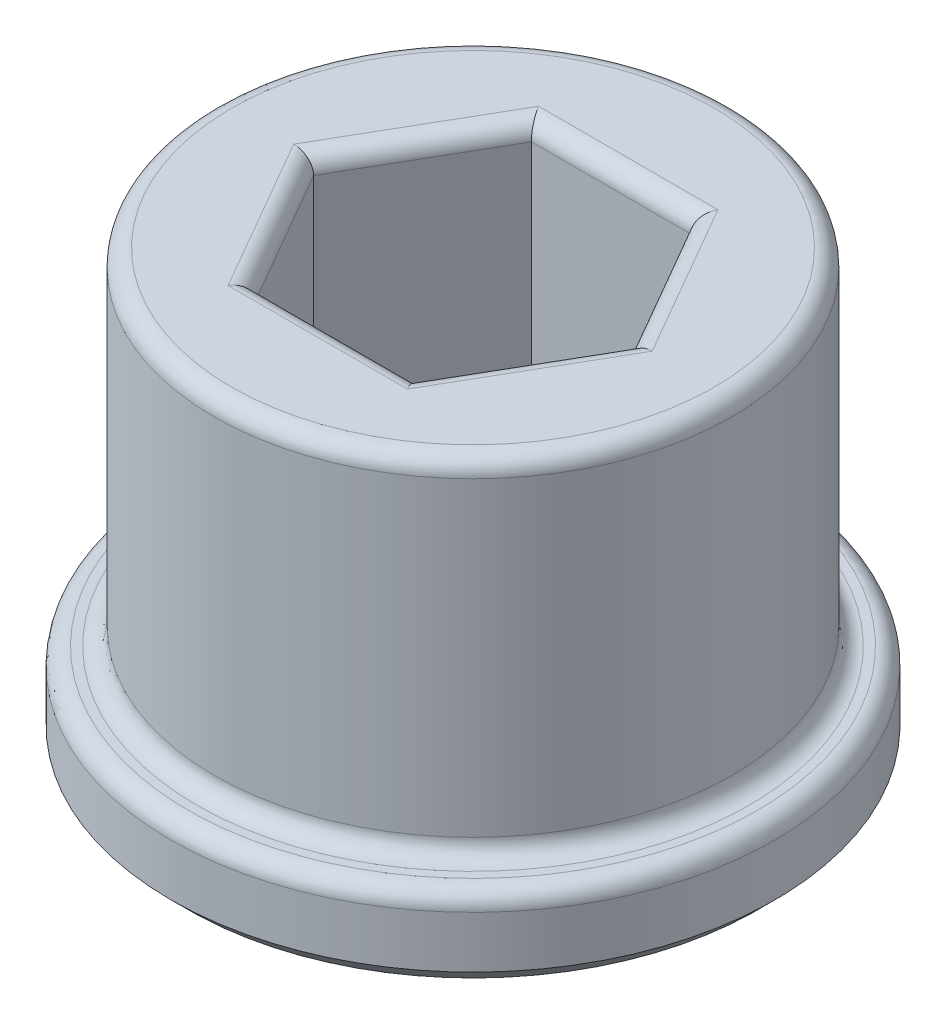
ISO-10303-21;
HEADER;
FILE_DESCRIPTION(('STEP AP214'),'2;1');
FILE_NAME('part.step','',(''),(''),'','','');
FILE_SCHEMA(('AUTOMOTIVE_DESIGN { 1 0 10303 214 1 1 1 1 }'));
ENDSEC;
DATA;
#1=APPLICATION_CONTEXT('core data for automotive mechanical design processes');
#2=APPLICATION_PROTOCOL_DEFINITION('international standard','automotive_design',2000,#1);
#3=PRODUCT_CONTEXT('',#1,'mechanical');
#4=PRODUCT('Part','Part','',(#3));
#5=PRODUCT_RELATED_PRODUCT_CATEGORY('part','',(#4));
#6=PRODUCT_DEFINITION_FORMATION('','',#4);
#7=PRODUCT_DEFINITION_CONTEXT('part definition',#1,'design');
#8=PRODUCT_DEFINITION('design','',#6,#7);
#9=PRODUCT_DEFINITION_SHAPE('','',#8);
#10=(LENGTH_UNIT() NAMED_UNIT(*) SI_UNIT(.MILLI.,.METRE.));
#11=(NAMED_UNIT(*) PLANE_ANGLE_UNIT() SI_UNIT($,.RADIAN.));
#12=(NAMED_UNIT(*) SI_UNIT($,.STERADIAN.) SOLID_ANGLE_UNIT());
#13=UNCERTAINTY_MEASURE_WITH_UNIT(LENGTH_MEASURE(1.E-05),#10,'distance_accuracy_value','');
#14=(GEOMETRIC_REPRESENTATION_CONTEXT(3) GLOBAL_UNCERTAINTY_ASSIGNED_CONTEXT((#13)) GLOBAL_UNIT_ASSIGNED_CONTEXT((#10,
#11,#12)) REPRESENTATION_CONTEXT('',''));
#15=CARTESIAN_POINT('',(0.,0.,0.));
#16=DIRECTION('',(0.,0.,1.));
#17=DIRECTION('',(1.,0.,0.));
#18=AXIS2_PLACEMENT_3D('',#15,#16,#17);
#19=CARTESIAN_POINT('',(0.,7.9375,0.));
#20=DIRECTION('',(0.,-1.,0.));
#21=DIRECTION('',(0.,0.,-1.));
#22=AXIS2_PLACEMENT_3D('',#19,#20,#21);
#23=CYLINDRICAL_SURFACE('',#22,9.525);
#24=CARTESIAN_POINT('',(0.,12.065,0.));
#25=DIRECTION('',(0.,1.,0.));
#26=DIRECTION('',(0.,0.,1.));
#27=AXIS2_PLACEMENT_3D('',#24,#25,#26);
#28=CIRCLE('',#27,9.525);
#29=CARTESIAN_POINT('',(0.,12.065,9.525));
#30=VERTEX_POINT('',#29);
#31=EDGE_CURVE('E250',#30,#30,#28,.F.);
#32=ORIENTED_EDGE('',*,*,#31,.T.);
#33=EDGE_LOOP('',(#32));
#34=FACE_BOUND('',#33,.T.);
#35=CARTESIAN_POINT('',(0.,0.635,0.));
#36=DIRECTION('',(0.,-1.,0.));
#37=DIRECTION('',(0.,0.,-1.));
#38=AXIS2_PLACEMENT_3D('',#35,#36,#37);
#39=CIRCLE('',#38,9.525);
#40=CARTESIAN_POINT('',(0.,0.635,-9.525));
#41=VERTEX_POINT('',#40);
#42=EDGE_CURVE('E205',#41,#41,#39,.F.);
#43=ORIENTED_EDGE('',*,*,#42,.T.);
#44=EDGE_LOOP('',(#43));
#45=FACE_BOUND('',#44,.T.);
#46=ADVANCED_FACE('F51',(#34,#45),#23,.T.);
#47=CARTESIAN_POINT('',(2.9329393674833,7.9375,5.08));
#48=DIRECTION('',(-0.866025403784439,0.,-0.5));
#49=DIRECTION('',(-0.5,0.,0.866025403784439));
#50=AXIS2_PLACEMENT_3D('',#47,#48,#49);
#51=PLANE('',#50);
#52=DIRECTION('',(0.,-1.,0.));
#53=VECTOR('',#52,1.);
#54=CARTESIAN_POINT('',(5.8658787349666,7.9375,0.));
#55=LINE('',#54,#53);
#56=CARTESIAN_POINT('',(5.8658787349666,12.065,0.));
#57=VERTEX_POINT('',#56);
#58=CARTESIAN_POINT('',(5.8658787349666,-2.54,0.));
#59=VERTEX_POINT('',#58);
#60=EDGE_CURVE('E201',#57,#59,#55,.T.);
#61=ORIENTED_EDGE('',*,*,#60,.T.);
#62=DIRECTION('',(-0.5,0.,0.866025403784439));
#63=VECTOR('',#62,1.);
#64=CARTESIAN_POINT('',(2.9329393674833,-2.54,5.08));
#65=LINE('',#64,#63);
#66=CARTESIAN_POINT('',(2.9329393674833,-2.54,5.08));
#67=VERTEX_POINT('',#66);
#68=EDGE_CURVE('E296',#59,#67,#65,.T.);
#69=ORIENTED_EDGE('',*,*,#68,.T.);
#70=DIRECTION('',(0.,-1.,0.));
#71=VECTOR('',#70,1.);
#72=CARTESIAN_POINT('',(2.9329393674833,7.9375,5.08));
#73=LINE('',#72,#71);
#74=CARTESIAN_POINT('',(2.9329393674833,12.065,5.08));
#75=VERTEX_POINT('',#74);
#76=EDGE_CURVE('E184',#75,#67,#73,.T.);
#77=ORIENTED_EDGE('',*,*,#76,.F.);
#78=DIRECTION('',(0.5,0.,-0.866025403784439));
#79=VECTOR('',#78,1.);
#80=CARTESIAN_POINT('',(2.9329393674833,12.065,5.08));
#81=LINE('',#80,#79);
#82=EDGE_CURVE('E170',#75,#57,#81,.T.);
#83=ORIENTED_EDGE('',*,*,#82,.T.);
#84=EDGE_LOOP('',(#61,#69,#77,#83));
#85=FACE_BOUND('',#84,.T.);
#86=ADVANCED_FACE('F386',(#85),#51,.T.);
#87=CARTESIAN_POINT('',(5.8658787349666,7.9375,0.));
#88=DIRECTION('',(-0.866025403784438,0.,0.5));
#89=DIRECTION('',(0.5,0.,0.866025403784438));
#90=AXIS2_PLACEMENT_3D('',#87,#88,#89);
#91=PLANE('',#90);
#92=DIRECTION('',(0.,-1.,0.));
#93=VECTOR('',#92,1.);
#94=CARTESIAN_POINT('',(2.9329393674833,7.9375,-5.08));
#95=LINE('',#94,#93);
#96=CARTESIAN_POINT('',(2.9329393674833,12.065,-5.08));
#97=VERTEX_POINT('',#96);
#98=CARTESIAN_POINT('',(2.9329393674833,-2.54,-5.08));
#99=VERTEX_POINT('',#98);
#100=EDGE_CURVE('E197',#97,#99,#95,.T.);
#101=ORIENTED_EDGE('',*,*,#100,.T.);
#102=DIRECTION('',(0.5,0.,0.866025403784438));
#103=VECTOR('',#102,1.);
#104=CARTESIAN_POINT('',(5.8658787349666,-2.54,0.));
#105=LINE('',#104,#103);
#106=EDGE_CURVE('E253',#99,#59,#105,.T.);
#107=ORIENTED_EDGE('',*,*,#106,.T.);
#108=ORIENTED_EDGE('',*,*,#60,.F.);
#109=DIRECTION('',(-0.5,0.,-0.866025403784438));
#110=VECTOR('',#109,1.);
#111=CARTESIAN_POINT('',(5.8658787349666,12.065,0.));
#112=LINE('',#111,#110);
#113=EDGE_CURVE('E241',#57,#97,#112,.T.);
#114=ORIENTED_EDGE('',*,*,#113,.T.);
#115=EDGE_LOOP('',(#101,#107,#108,#114));
#116=FACE_BOUND('',#115,.T.);
#117=ADVANCED_FACE('F354',(#116),#91,.T.);
#118=CARTESIAN_POINT('',(2.9329393674833,7.9375,-5.08));
#119=DIRECTION('',(0.,0.,1.));
#120=DIRECTION('',(1.,0.,0.));
#121=AXIS2_PLACEMENT_3D('',#118,#119,#120);
#122=PLANE('',#121);
#123=DIRECTION('',(0.,-1.,0.));
#124=VECTOR('',#123,1.);
#125=CARTESIAN_POINT('',(-2.9329393674833,7.9375,-5.08));
#126=LINE('',#125,#124);
#127=CARTESIAN_POINT('',(-2.9329393674833,12.065,-5.08));
#128=VERTEX_POINT('',#127);
#129=CARTESIAN_POINT('',(-2.9329393674833,-2.54,-5.08));
#130=VERTEX_POINT('',#129);
#131=EDGE_CURVE('E189',#128,#130,#126,.T.);
#132=ORIENTED_EDGE('',*,*,#131,.T.);
#133=DIRECTION('',(1.,0.,0.));
#134=VECTOR('',#133,1.);
#135=CARTESIAN_POINT('',(2.9329393674833,-2.54,-5.08));
#136=LINE('',#135,#134);
#137=EDGE_CURVE('E62',#130,#99,#136,.T.);
#138=ORIENTED_EDGE('',*,*,#137,.T.);
#139=ORIENTED_EDGE('',*,*,#100,.F.);
#140=DIRECTION('',(-1.,0.,0.));
#141=VECTOR('',#140,1.);
#142=CARTESIAN_POINT('',(2.9329393674833,12.065,-5.08));
#143=LINE('',#142,#141);
#144=EDGE_CURVE('E244',#97,#128,#143,.T.);
#145=ORIENTED_EDGE('',*,*,#144,.T.);
#146=EDGE_LOOP('',(#132,#138,#139,#145));
#147=FACE_BOUND('',#146,.T.);
#148=ADVANCED_FACE('F351',(#147),#122,.T.);
#149=CARTESIAN_POINT('',(-2.9329393674833,7.9375,-5.08));
#150=DIRECTION('',(0.866025403784438,0.,0.5));
#151=DIRECTION('',(0.5,0.,-0.866025403784439));
#152=AXIS2_PLACEMENT_3D('',#149,#150,#151);
#153=PLANE('',#152);
#154=DIRECTION('',(0.,-1.,0.));
#155=VECTOR('',#154,1.);
#156=CARTESIAN_POINT('',(-5.8658787349666,7.9375,0.));
#157=LINE('',#156,#155);
#158=CARTESIAN_POINT('',(-5.8658787349666,12.065,0.));
#159=VERTEX_POINT('',#158);
#160=CARTESIAN_POINT('',(-5.8658787349666,-2.54,0.));
#161=VERTEX_POINT('',#160);
#162=EDGE_CURVE('E174',#159,#161,#157,.T.);
#163=ORIENTED_EDGE('',*,*,#162,.T.);
#164=DIRECTION('',(0.5,0.,-0.866025403784439));
#165=VECTOR('',#164,1.);
#166=CARTESIAN_POINT('',(-2.9329393674833,-2.54,-5.08));
#167=LINE('',#166,#165);
#168=EDGE_CURVE('E70',#161,#130,#167,.T.);
#169=ORIENTED_EDGE('',*,*,#168,.T.);
#170=ORIENTED_EDGE('',*,*,#131,.F.);
#171=DIRECTION('',(-0.5,0.,0.866025403784439));
#172=VECTOR('',#171,1.);
#173=CARTESIAN_POINT('',(-2.9329393674833,12.065,-5.08));
#174=LINE('',#173,#172);
#175=EDGE_CURVE('E247',#128,#159,#174,.T.);
#176=ORIENTED_EDGE('',*,*,#175,.T.);
#177=EDGE_LOOP('',(#163,#169,#170,#176));
#178=FACE_BOUND('',#177,.T.);
#179=ADVANCED_FACE('F374',(#178),#153,.T.);
#180=CARTESIAN_POINT('',(-5.8658787349666,7.9375,0.));
#181=DIRECTION('',(0.866025403784438,0.,-0.5));
#182=DIRECTION('',(-0.5,0.,-0.866025403784439));
#183=AXIS2_PLACEMENT_3D('',#180,#181,#182);
#184=PLANE('',#183);
#185=DIRECTION('',(0.,-1.,0.));
#186=VECTOR('',#185,1.);
#187=CARTESIAN_POINT('',(-2.9329393674833,7.9375,5.08));
#188=LINE('',#187,#186);
#189=CARTESIAN_POINT('',(-2.9329393674833,12.065,5.08));
#190=VERTEX_POINT('',#189);
#191=CARTESIAN_POINT('',(-2.9329393674833,-2.54,5.08));
#192=VERTEX_POINT('',#191);
#193=EDGE_CURVE('E173',#190,#192,#188,.T.);
#194=ORIENTED_EDGE('',*,*,#193,.T.);
#195=DIRECTION('',(-0.5,0.,-0.866025403784439));
#196=VECTOR('',#195,1.);
#197=CARTESIAN_POINT('',(-5.8658787349666,-2.54,0.));
#198=LINE('',#197,#196);
#199=EDGE_CURVE('E78',#192,#161,#198,.T.);
#200=ORIENTED_EDGE('',*,*,#199,.T.);
#201=ORIENTED_EDGE('',*,*,#162,.F.);
#202=DIRECTION('',(0.5,0.,0.866025403784439));
#203=VECTOR('',#202,1.);
#204=CARTESIAN_POINT('',(-5.8658787349666,12.065,0.));
#205=LINE('',#204,#203);
#206=EDGE_CURVE('E152',#159,#190,#205,.T.);
#207=ORIENTED_EDGE('',*,*,#206,.T.);
#208=EDGE_LOOP('',(#194,#200,#201,#207));
#209=FACE_BOUND('',#208,.T.);
#210=ADVANCED_FACE('F172',(#209),#184,.T.);
#211=CARTESIAN_POINT('',(-2.9329393674833,7.9375,5.08));
#212=DIRECTION('',(0.,0.,-1.));
#213=DIRECTION('',(-1.,0.,0.));
#214=AXIS2_PLACEMENT_3D('',#211,#212,#213);
#215=PLANE('',#214);
#216=ORIENTED_EDGE('',*,*,#76,.T.);
#217=DIRECTION('',(-1.,0.,0.));
#218=VECTOR('',#217,1.);
#219=CARTESIAN_POINT('',(-2.9329393674833,-2.54,5.08));
#220=LINE('',#219,#218);
#221=EDGE_CURVE('E182',#67,#192,#220,.T.);
#222=ORIENTED_EDGE('',*,*,#221,.T.);
#223=ORIENTED_EDGE('',*,*,#193,.F.);
#224=DIRECTION('',(1.,0.,0.));
#225=VECTOR('',#224,1.);
#226=CARTESIAN_POINT('',(-2.9329393674833,12.065,5.08));
#227=LINE('',#226,#225);
#228=EDGE_CURVE('E161',#190,#75,#227,.T.);
#229=ORIENTED_EDGE('',*,*,#228,.T.);
#230=EDGE_LOOP('',(#216,#222,#223,#229));
#231=FACE_BOUND('',#230,.T.);
#232=ADVANCED_FACE('F180',(#231),#215,.T.);
#233=CARTESIAN_POINT('',(0.,12.7,0.));
#234=DIRECTION('',(0.,1.,0.));
#235=DIRECTION('',(0.,0.,1.));
#236=AXIS2_PLACEMENT_3D('',#233,#234,#235);
#237=PLANE('',#236);
#238=DIRECTION('',(1.,0.,0.));
#239=VECTOR('',#238,1.);
#240=CARTESIAN_POINT('',(0.,12.7,5.715));
#241=LINE('',#240,#239);
#242=CARTESIAN_POINT('',(3.29955678841871,12.7,5.715));
#243=VERTEX_POINT('',#242);
#244=CARTESIAN_POINT('',(-3.29955678841871,12.7,5.715));
#245=VERTEX_POINT('',#244);
#246=EDGE_CURVE('E234',#243,#245,#241,.F.);
#247=ORIENTED_EDGE('',*,*,#246,.T.);
#248=DIRECTION('',(0.5,0.,0.866025403784439));
#249=VECTOR('',#248,1.);
#250=CARTESIAN_POINT('',(-4.94933518262807,12.7,2.8575));
#251=LINE('',#250,#249);
#252=CARTESIAN_POINT('',(-6.59911357683742,12.7,0.));
#253=VERTEX_POINT('',#252);
#254=EDGE_CURVE('E154',#245,#253,#251,.F.);
#255=ORIENTED_EDGE('',*,*,#254,.T.);
#256=DIRECTION('',(-0.5,0.,0.866025403784439));
#257=VECTOR('',#256,1.);
#258=CARTESIAN_POINT('',(-4.94933518262807,12.7,-2.8575));
#259=LINE('',#258,#257);
#260=CARTESIAN_POINT('',(-3.29955678841871,12.7,-5.715));
#261=VERTEX_POINT('',#260);
#262=EDGE_CURVE('E223',#253,#261,#259,.F.);
#263=ORIENTED_EDGE('',*,*,#262,.T.);
#264=DIRECTION('',(-1.,0.,0.));
#265=VECTOR('',#264,1.);
#266=CARTESIAN_POINT('',(0.,12.7,-5.715));
#267=LINE('',#266,#265);
#268=CARTESIAN_POINT('',(3.29955678841871,12.7,-5.715));
#269=VERTEX_POINT('',#268);
#270=EDGE_CURVE('E226',#261,#269,#267,.F.);
#271=ORIENTED_EDGE('',*,*,#270,.T.);
#272=DIRECTION('',(-0.5,0.,-0.866025403784438));
#273=VECTOR('',#272,1.);
#274=CARTESIAN_POINT('',(4.94933518262807,12.7,-2.8575));
#275=LINE('',#274,#273);
#276=CARTESIAN_POINT('',(6.59911357683742,12.7,0.));
#277=VERTEX_POINT('',#276);
#278=EDGE_CURVE('E228',#269,#277,#275,.F.);
#279=ORIENTED_EDGE('',*,*,#278,.T.);
#280=DIRECTION('',(0.5,0.,-0.866025403784439));
#281=VECTOR('',#280,1.);
#282=CARTESIAN_POINT('',(4.94933518262807,12.7,2.8575));
#283=LINE('',#282,#281);
#284=EDGE_CURVE('E231',#277,#243,#283,.F.);
#285=ORIENTED_EDGE('',*,*,#284,.T.);
#286=EDGE_LOOP('',(#247,#255,#263,#271,#279,#285));
#287=FACE_BOUND('',#286,.T.);
#288=CARTESIAN_POINT('',(0.,12.7,0.));
#289=DIRECTION('',(0.,1.,0.));
#290=DIRECTION('',(0.,0.,1.));
#291=AXIS2_PLACEMENT_3D('',#288,#289,#290);
#292=CIRCLE('',#291,8.89);
#293=CARTESIAN_POINT('',(0.,12.7,8.89));
#294=VERTEX_POINT('',#293);
#295=EDGE_CURVE('E177',#294,#294,#292,.T.);
#296=ORIENTED_EDGE('',*,*,#295,.T.);
#297=EDGE_LOOP('',(#296));
#298=FACE_BOUND('',#297,.T.);
#299=ADVANCED_FACE('F367',(#287,#298),#237,.T.);
#300=CARTESIAN_POINT('',(0.,-3.175,0.));
#301=DIRECTION('',(0.,-1.,0.));
#302=DIRECTION('',(0.,0.,-1.));
#303=AXIS2_PLACEMENT_3D('',#300,#301,#302);
#304=PLANE('',#303);
#305=DIRECTION('',(0.5,0.,-0.866025403784439));
#306=VECTOR('',#305,1.);
#307=CARTESIAN_POINT('',(4.94933518262807,-3.175,2.8575));
#308=LINE('',#307,#306);
#309=CARTESIAN_POINT('',(3.29955678841872,-3.175,5.715));
#310=VERTEX_POINT('',#309);
#311=CARTESIAN_POINT('',(6.59911357683743,-3.175,0.));
#312=VERTEX_POINT('',#311);
#313=EDGE_CURVE('E289',#310,#312,#308,.T.);
#314=ORIENTED_EDGE('',*,*,#313,.T.);
#315=DIRECTION('',(-0.5,0.,-0.866025403784439));
#316=VECTOR('',#315,1.);
#317=CARTESIAN_POINT('',(4.94933518262807,-3.175,-2.8575));
#318=LINE('',#317,#316);
#319=CARTESIAN_POINT('',(3.29955678841871,-3.175,-5.71500000000001));
#320=VERTEX_POINT('',#319);
#321=EDGE_CURVE('E292',#312,#320,#318,.T.);
#322=ORIENTED_EDGE('',*,*,#321,.T.);
#323=DIRECTION('',(-1.,0.,0.));
#324=VECTOR('',#323,1.);
#325=CARTESIAN_POINT('',(0.,-3.175,-5.71500000000001));
#326=LINE('',#325,#324);
#327=CARTESIAN_POINT('',(-3.29955678841871,-3.175,-5.71500000000001));
#328=VERTEX_POINT('',#327);
#329=EDGE_CURVE('E277',#320,#328,#326,.T.);
#330=ORIENTED_EDGE('',*,*,#329,.T.);
#331=DIRECTION('',(-0.5,0.,0.866025403784439));
#332=VECTOR('',#331,1.);
#333=CARTESIAN_POINT('',(-4.94933518262807,-3.175,-2.8575));
#334=LINE('',#333,#332);
#335=CARTESIAN_POINT('',(-6.59911357683743,-3.175,0.));
#336=VERTEX_POINT('',#335);
#337=EDGE_CURVE('E280',#328,#336,#334,.T.);
#338=ORIENTED_EDGE('',*,*,#337,.T.);
#339=DIRECTION('',(0.5,0.,0.866025403784439));
#340=VECTOR('',#339,1.);
#341=CARTESIAN_POINT('',(-4.94933518262807,-3.175,2.8575));
#342=LINE('',#341,#340);
#343=CARTESIAN_POINT('',(-3.29955678841871,-3.175,5.715));
#344=VERTEX_POINT('',#343);
#345=EDGE_CURVE('E283',#336,#344,#342,.T.);
#346=ORIENTED_EDGE('',*,*,#345,.T.);
#347=DIRECTION('',(1.,0.,0.));
#348=VECTOR('',#347,1.);
#349=CARTESIAN_POINT('',(0.,-3.175,5.715));
#350=LINE('',#349,#348);
#351=EDGE_CURVE('E286',#344,#310,#350,.T.);
#352=ORIENTED_EDGE('',*,*,#351,.T.);
#353=EDGE_LOOP('',(#314,#322,#330,#338,#346,#352));
#354=FACE_BOUND('',#353,.T.);
#355=CARTESIAN_POINT('',(0.,-3.175,0.));
#356=DIRECTION('',(0.,-1.,0.));
#357=DIRECTION('',(0.,0.,-1.));
#358=AXIS2_PLACEMENT_3D('',#355,#356,#357);
#359=CIRCLE('',#358,10.4775);
#360=CARTESIAN_POINT('',(0.,-3.175,-10.4775));
#361=VERTEX_POINT('',#360);
#362=EDGE_CURVE('E273',#361,#361,#359,.T.);
#363=ORIENTED_EDGE('',*,*,#362,.T.);
#364=EDGE_LOOP('',(#363));
#365=FACE_BOUND('',#364,.T.);
#366=ADVANCED_FACE('F339',(#354,#365),#304,.T.);
#367=CARTESIAN_POINT('',(0.,0.,0.));
#368=DIRECTION('',(0.,-1.,0.));
#369=DIRECTION('',(0.,0.,-1.));
#370=AXIS2_PLACEMENT_3D('',#367,#368,#369);
#371=PLANE('',#370);
#372=CARTESIAN_POINT('',(0.,0.,0.));
#373=DIRECTION('',(0.,-1.,0.));
#374=DIRECTION('',(0.,0.,-1.));
#375=AXIS2_PLACEMENT_3D('',#372,#373,#374);
#376=CIRCLE('',#375,10.16);
#377=CARTESIAN_POINT('',(0.,0.,-10.16));
#378=VERTEX_POINT('',#377);
#379=EDGE_CURVE('E213',#378,#378,#376,.T.);
#380=ORIENTED_EDGE('',*,*,#379,.T.);
#381=EDGE_LOOP('',(#380));
#382=FACE_BOUND('',#381,.T.);
#383=CARTESIAN_POINT('',(0.,0.,0.));
#384=DIRECTION('',(0.,-1.,0.));
#385=DIRECTION('',(0.,0.,-1.));
#386=AXIS2_PLACEMENT_3D('',#383,#384,#385);
#387=CIRCLE('',#386,10.4775);
#388=CARTESIAN_POINT('',(0.,0.,-10.4775));
#389=VERTEX_POINT('',#388);
#390=EDGE_CURVE('E209',#389,#389,#387,.F.);
#391=ORIENTED_EDGE('',*,*,#390,.T.);
#392=EDGE_LOOP('',(#391));
#393=FACE_BOUND('',#392,.T.);
#394=ADVANCED_FACE('F573',(#382,#393),#371,.F.);
#395=CARTESIAN_POINT('',(0.,-3.175,0.));
#396=DIRECTION('',(0.,1.,0.));
#397=DIRECTION('',(0.,0.,1.));
#398=AXIS2_PLACEMENT_3D('',#395,#396,#397);
#399=CYLINDRICAL_SURFACE('',#398,11.1125);
#400=CARTESIAN_POINT('',(0.,-2.54,0.));
#401=DIRECTION('',(0.,-1.,0.));
#402=DIRECTION('',(0.,0.,-1.));
#403=AXIS2_PLACEMENT_3D('',#400,#401,#402);
#404=CIRCLE('',#403,11.1125);
#405=CARTESIAN_POINT('',(0.,-2.54,-11.1125));
#406=VERTEX_POINT('',#405);
#407=EDGE_CURVE('E11',#406,#406,#404,.F.);
#408=ORIENTED_EDGE('',*,*,#407,.T.);
#409=EDGE_LOOP('',(#408));
#410=FACE_BOUND('',#409,.T.);
#411=CARTESIAN_POINT('',(0.,-0.635,0.));
#412=DIRECTION('',(0.,-1.,0.));
#413=DIRECTION('',(0.,0.,-1.));
#414=AXIS2_PLACEMENT_3D('',#411,#412,#413);
#415=CIRCLE('',#414,11.1125);
#416=CARTESIAN_POINT('',(0.,-0.635,-11.1125));
#417=VERTEX_POINT('',#416);
#418=EDGE_CURVE('E178',#417,#417,#415,.T.);
#419=ORIENTED_EDGE('',*,*,#418,.T.);
#420=EDGE_LOOP('',(#419));
#421=FACE_BOUND('',#420,.T.);
#422=ADVANCED_FACE('F400',(#410,#421),#399,.T.);
#423=CARTESIAN_POINT('',(0.,0.635,0.));
#424=DIRECTION('',(0.,-1.,0.));
#425=DIRECTION('',(0.,0.,-1.));
#426=AXIS2_PLACEMENT_3D('',#423,#424,#425);
#427=TOROIDAL_SURFACE('',#426,10.16,0.635);
#428=ORIENTED_EDGE('',*,*,#379,.F.);
#429=EDGE_LOOP('',(#428));
#430=FACE_BOUND('',#429,.T.);
#431=ORIENTED_EDGE('',*,*,#42,.F.);
#432=EDGE_LOOP('',(#431));
#433=FACE_BOUND('',#432,.T.);
#434=ADVANCED_FACE('F396',(#430,#433),#427,.F.);
#435=CARTESIAN_POINT('',(0.,-0.635,0.));
#436=DIRECTION('',(0.,-1.,0.));
#437=DIRECTION('',(0.,0.,-1.));
#438=AXIS2_PLACEMENT_3D('',#435,#436,#437);
#439=TOROIDAL_SURFACE('',#438,10.4775,0.635);
#440=ORIENTED_EDGE('',*,*,#390,.F.);
#441=EDGE_LOOP('',(#440));
#442=FACE_BOUND('',#441,.T.);
#443=ORIENTED_EDGE('',*,*,#418,.F.);
#444=EDGE_LOOP('',(#443));
#445=FACE_BOUND('',#444,.T.);
#446=ADVANCED_FACE('F399',(#442,#445),#439,.T.);
#447=CARTESIAN_POINT('',(6.41580486636972,12.065,-0.3175));
#448=DIRECTION('',(-0.5,0.,-0.866025403784438));
#449=DIRECTION('',(-0.866025403784438,0.,0.5));
#450=AXIS2_PLACEMENT_3D('',#447,#448,#449);
#451=CYLINDRICAL_SURFACE('',#450,0.635);
#452=CARTESIAN_POINT('',(6.59911357683742,12.065,0.));
#453=DIRECTION('',(0.,0.,-1.));
#454=DIRECTION('',(1.,0.,0.));
#455=AXIS2_PLACEMENT_3D('',#452,#453,#454);
#456=ELLIPSE('',#455,0.733234841870825,0.635);
#457=EDGE_CURVE('E263',#277,#57,#456,.F.);
#458=ORIENTED_EDGE('',*,*,#457,.F.);
#459=ORIENTED_EDGE('',*,*,#278,.F.);
#460=CARTESIAN_POINT('',(3.29955678841871,12.065,-5.715));
#461=DIRECTION('',(-0.866025403784439,0.,-0.5));
#462=DIRECTION('',(0.5,0.,-0.866025403784439));
#463=AXIS2_PLACEMENT_3D('',#460,#461,#462);
#464=ELLIPSE('',#463,0.733234841870825,0.635);
#465=EDGE_CURVE('E192',#97,#269,#464,.T.);
#466=ORIENTED_EDGE('',*,*,#465,.F.);
#467=ORIENTED_EDGE('',*,*,#113,.F.);
#468=EDGE_LOOP('',(#458,#459,#466,#467));
#469=FACE_BOUND('',#468,.T.);
#470=ADVANCED_FACE('F359',(#469),#451,.T.);
#471=CARTESIAN_POINT('',(2.9329393674833,12.065,-5.715));
#472=DIRECTION('',(-1.,0.,0.));
#473=DIRECTION('',(0.,0.,1.));
#474=AXIS2_PLACEMENT_3D('',#471,#472,#473);
#475=CYLINDRICAL_SURFACE('',#474,0.635);
#476=ORIENTED_EDGE('',*,*,#465,.T.);
#477=ORIENTED_EDGE('',*,*,#270,.F.);
#478=CARTESIAN_POINT('',(-3.29955678841871,12.065,-5.715));
#479=DIRECTION('',(-0.866025403784439,0.,0.5));
#480=DIRECTION('',(-0.5,0.,-0.866025403784439));
#481=AXIS2_PLACEMENT_3D('',#478,#479,#480);
#482=ELLIPSE('',#481,0.733234841870825,0.635);
#483=EDGE_CURVE('E259',#128,#261,#482,.T.);
#484=ORIENTED_EDGE('',*,*,#483,.F.);
#485=ORIENTED_EDGE('',*,*,#144,.F.);
#486=EDGE_LOOP('',(#476,#477,#484,#485));
#487=FACE_BOUND('',#486,.T.);
#488=ADVANCED_FACE('F371',(#487),#475,.T.);
#489=CARTESIAN_POINT('',(3.48286549888642,12.065,5.3975));
#490=DIRECTION('',(0.5,0.,-0.866025403784439));
#491=DIRECTION('',(-0.866025403784439,0.,-0.5));
#492=AXIS2_PLACEMENT_3D('',#489,#490,#491);
#493=CYLINDRICAL_SURFACE('',#492,0.635);
#494=ORIENTED_EDGE('',*,*,#457,.T.);
#495=ORIENTED_EDGE('',*,*,#82,.F.);
#496=CARTESIAN_POINT('',(3.29955678841871,12.065,5.715));
#497=DIRECTION('',(0.866025403784439,0.,-0.5));
#498=DIRECTION('',(0.5,0.,0.866025403784439));
#499=AXIS2_PLACEMENT_3D('',#496,#497,#498);
#500=ELLIPSE('',#499,0.733234841870825,0.635);
#501=EDGE_CURVE('E164',#243,#75,#500,.F.);
#502=ORIENTED_EDGE('',*,*,#501,.F.);
#503=ORIENTED_EDGE('',*,*,#284,.F.);
#504=EDGE_LOOP('',(#494,#495,#502,#503));
#505=FACE_BOUND('',#504,.T.);
#506=ADVANCED_FACE('F365',(#505),#493,.T.);
#507=CARTESIAN_POINT('',(-3.48286549888642,12.065,-5.3975));
#508=DIRECTION('',(-0.5,0.,0.866025403784439));
#509=DIRECTION('',(0.866025403784438,0.,0.5));
#510=AXIS2_PLACEMENT_3D('',#507,#508,#509);
#511=CYLINDRICAL_SURFACE('',#510,0.635);
#512=ORIENTED_EDGE('',*,*,#483,.T.);
#513=ORIENTED_EDGE('',*,*,#262,.F.);
#514=CARTESIAN_POINT('',(-6.59911357683742,12.065,0.));
#515=DIRECTION('',(0.,0.,1.));
#516=DIRECTION('',(1.,0.,0.));
#517=AXIS2_PLACEMENT_3D('',#514,#515,#516);
#518=ELLIPSE('',#517,0.733234841870825,0.635);
#519=EDGE_CURVE('E158',#159,#253,#518,.T.);
#520=ORIENTED_EDGE('',*,*,#519,.F.);
#521=ORIENTED_EDGE('',*,*,#175,.F.);
#522=EDGE_LOOP('',(#512,#513,#520,#521));
#523=FACE_BOUND('',#522,.T.);
#524=ADVANCED_FACE('F376',(#523),#511,.T.);
#525=CARTESIAN_POINT('',(-2.9329393674833,12.065,5.715));
#526=DIRECTION('',(1.,0.,0.));
#527=DIRECTION('',(0.,0.,-1.));
#528=AXIS2_PLACEMENT_3D('',#525,#526,#527);
#529=CYLINDRICAL_SURFACE('',#528,0.635);
#530=ORIENTED_EDGE('',*,*,#501,.T.);
#531=ORIENTED_EDGE('',*,*,#228,.F.);
#532=CARTESIAN_POINT('',(-3.29955678841871,12.065,5.715));
#533=DIRECTION('',(0.866025403784439,0.,0.5));
#534=DIRECTION('',(-0.5,0.,0.866025403784439));
#535=AXIS2_PLACEMENT_3D('',#532,#533,#534);
#536=ELLIPSE('',#535,0.733234841870825,0.635);
#537=EDGE_CURVE('E148',#245,#190,#536,.F.);
#538=ORIENTED_EDGE('',*,*,#537,.F.);
#539=ORIENTED_EDGE('',*,*,#246,.F.);
#540=EDGE_LOOP('',(#530,#531,#538,#539));
#541=FACE_BOUND('',#540,.T.);
#542=ADVANCED_FACE('F162',(#541),#529,.T.);
#543=CARTESIAN_POINT('',(-6.41580486636972,12.065,0.317499999999997));
#544=DIRECTION('',(0.5,0.,0.866025403784439));
#545=DIRECTION('',(0.866025403784438,0.,-0.5));
#546=AXIS2_PLACEMENT_3D('',#543,#544,#545);
#547=CYLINDRICAL_SURFACE('',#546,0.635);
#548=ORIENTED_EDGE('',*,*,#519,.T.);
#549=ORIENTED_EDGE('',*,*,#254,.F.);
#550=ORIENTED_EDGE('',*,*,#537,.T.);
#551=ORIENTED_EDGE('',*,*,#206,.F.);
#552=EDGE_LOOP('',(#548,#549,#550,#551));
#553=FACE_BOUND('',#552,.T.);
#554=ADVANCED_FACE('F150',(#553),#547,.T.);
#555=CARTESIAN_POINT('',(0.,12.065,0.));
#556=DIRECTION('',(0.,1.,0.));
#557=DIRECTION('',(0.,0.,1.));
#558=AXIS2_PLACEMENT_3D('',#555,#556,#557);
#559=TOROIDAL_SURFACE('',#558,8.89,0.635);
#560=ORIENTED_EDGE('',*,*,#31,.F.);
#561=EDGE_LOOP('',(#560));
#562=FACE_BOUND('',#561,.T.);
#563=ORIENTED_EDGE('',*,*,#295,.F.);
#564=EDGE_LOOP('',(#563));
#565=FACE_BOUND('',#564,.T.);
#566=ADVANCED_FACE('F406',(#562,#565),#559,.T.);
#567=CARTESIAN_POINT('',(-5.8658787349666,-2.54,0.));
#568=DIRECTION('',(-0.612372435695792,0.707106781186551,0.353553390593272));
#569=DIRECTION('',(-0.5,0.,-0.866025403784439));
#570=AXIS2_PLACEMENT_3D('',#567,#568,#569);
#571=PLANE('',#570);
#572=DIRECTION('',(-0.377964473009229,-0.654653670707974,0.654653670707979));
#573=VECTOR('',#572,1.);
#574=CARTESIAN_POINT('',(-2.9329393674833,-2.54,5.08));
#575=LINE('',#574,#573);
#576=EDGE_CURVE('E320',#344,#192,#575,.F.);
#577=ORIENTED_EDGE('',*,*,#576,.F.);
#578=ORIENTED_EDGE('',*,*,#345,.F.);
#579=DIRECTION('',(-0.755928946018457,-0.654653670707974,0.));
#580=VECTOR('',#579,1.);
#581=CARTESIAN_POINT('',(-5.8658787349666,-2.54,0.));
#582=LINE('',#581,#580);
#583=EDGE_CURVE('E56',#161,#336,#582,.T.);
#584=ORIENTED_EDGE('',*,*,#583,.F.);
#585=ORIENTED_EDGE('',*,*,#199,.F.);
#586=EDGE_LOOP('',(#577,#578,#584,#585));
#587=FACE_BOUND('',#586,.T.);
#588=ADVANCED_FACE('F337',(#587),#571,.F.);
#589=CARTESIAN_POINT('',(-2.9329393674833,-2.54,-5.08));
#590=DIRECTION('',(-0.612372435695792,0.70710678118655,-0.353553390593273));
#591=DIRECTION('',(0.5,0.,-0.866025403784439));
#592=AXIS2_PLACEMENT_3D('',#589,#590,#591);
#593=PLANE('',#592);
#594=ORIENTED_EDGE('',*,*,#583,.T.);
#595=ORIENTED_EDGE('',*,*,#337,.F.);
#596=DIRECTION('',(-0.377964473009228,-0.654653670707975,-0.654653670707979));
#597=VECTOR('',#596,1.);
#598=CARTESIAN_POINT('',(-2.9329393674833,-2.54,-5.08));
#599=LINE('',#598,#597);
#600=EDGE_CURVE('E317',#130,#328,#599,.T.);
#601=ORIENTED_EDGE('',*,*,#600,.F.);
#602=ORIENTED_EDGE('',*,*,#168,.F.);
#603=EDGE_LOOP('',(#594,#595,#601,#602));
#604=FACE_BOUND('',#603,.T.);
#605=ADVANCED_FACE('F333',(#604),#593,.F.);
#606=CARTESIAN_POINT('',(-2.9329393674833,-2.54,5.08));
#607=DIRECTION('',(0.,0.70710678118655,0.707106781186545));
#608=DIRECTION('',(-1.,0.,0.));
#609=AXIS2_PLACEMENT_3D('',#606,#607,#608);
#610=PLANE('',#609);
#611=ORIENTED_EDGE('',*,*,#576,.T.);
#612=ORIENTED_EDGE('',*,*,#221,.F.);
#613=DIRECTION('',(0.377964473009229,-0.654653670707974,0.654653670707979));
#614=VECTOR('',#613,1.);
#615=CARTESIAN_POINT('',(2.9329393674833,-2.54,5.08));
#616=LINE('',#615,#614);
#617=EDGE_CURVE('E313',#310,#67,#616,.F.);
#618=ORIENTED_EDGE('',*,*,#617,.F.);
#619=ORIENTED_EDGE('',*,*,#351,.F.);
#620=EDGE_LOOP('',(#611,#612,#618,#619));
#621=FACE_BOUND('',#620,.T.);
#622=ADVANCED_FACE('F438',(#621),#610,.F.);
#623=CARTESIAN_POINT('',(2.9329393674833,-2.54,-5.08));
#624=DIRECTION('',(0.,0.70710678118655,-0.707106781186545));
#625=DIRECTION('',(1.,0.,0.));
#626=AXIS2_PLACEMENT_3D('',#623,#624,#625);
#627=PLANE('',#626);
#628=ORIENTED_EDGE('',*,*,#600,.T.);
#629=ORIENTED_EDGE('',*,*,#329,.F.);
#630=DIRECTION('',(-0.377964473009228,0.654653670707975,0.654653670707979));
#631=VECTOR('',#630,1.);
#632=CARTESIAN_POINT('',(2.09495669105949,-1.08857142857143,-3.62857142857142));
#633=LINE('',#632,#631);
#634=EDGE_CURVE('E310',#99,#320,#633,.F.);
#635=ORIENTED_EDGE('',*,*,#634,.F.);
#636=ORIENTED_EDGE('',*,*,#137,.F.);
#637=EDGE_LOOP('',(#628,#629,#635,#636));
#638=FACE_BOUND('',#637,.T.);
#639=ADVANCED_FACE('F346',(#638),#627,.F.);
#640=CARTESIAN_POINT('',(2.9329393674833,-2.54,5.08));
#641=DIRECTION('',(0.612372435695792,0.70710678118655,0.353553390593272));
#642=DIRECTION('',(-0.5,0.,0.866025403784439));
#643=AXIS2_PLACEMENT_3D('',#640,#641,#642);
#644=PLANE('',#643);
#645=ORIENTED_EDGE('',*,*,#617,.T.);
#646=ORIENTED_EDGE('',*,*,#68,.F.);
#647=DIRECTION('',(0.755928946018457,-0.654653670707975,0.));
#648=VECTOR('',#647,1.);
#649=CARTESIAN_POINT('',(5.8658787349666,-2.54,0.));
#650=LINE('',#649,#648);
#651=EDGE_CURVE('E307',#312,#59,#650,.F.);
#652=ORIENTED_EDGE('',*,*,#651,.F.);
#653=ORIENTED_EDGE('',*,*,#313,.F.);
#654=EDGE_LOOP('',(#645,#646,#652,#653));
#655=FACE_BOUND('',#654,.T.);
#656=ADVANCED_FACE('F425',(#655),#644,.F.);
#657=CARTESIAN_POINT('',(5.8658787349666,-2.54,0.));
#658=DIRECTION('',(0.612372435695792,0.70710678118655,-0.353553390593273));
#659=DIRECTION('',(0.5,0.,0.866025403784438));
#660=AXIS2_PLACEMENT_3D('',#657,#658,#659);
#661=PLANE('',#660);
#662=ORIENTED_EDGE('',*,*,#634,.T.);
#663=ORIENTED_EDGE('',*,*,#321,.F.);
#664=ORIENTED_EDGE('',*,*,#651,.T.);
#665=ORIENTED_EDGE('',*,*,#106,.F.);
#666=EDGE_LOOP('',(#662,#663,#664,#665));
#667=FACE_BOUND('',#666,.T.);
#668=ADVANCED_FACE('F419',(#667),#661,.F.);
#669=CARTESIAN_POINT('',(0.,-3.175,0.));
#670=DIRECTION('',(0.,1.,0.));
#671=DIRECTION('',(0.,0.,1.));
#672=AXIS2_PLACEMENT_3D('',#669,#670,#671);
#673=CONICAL_SURFACE('',#672,10.4775,0.785398163397448);
#674=ORIENTED_EDGE('',*,*,#407,.F.);
#675=EDGE_LOOP('',(#674));
#676=FACE_BOUND('',#675,.T.);
#677=ORIENTED_EDGE('',*,*,#362,.F.);
#678=EDGE_LOOP('',(#677));
#679=FACE_BOUND('',#678,.T.);
#680=ADVANCED_FACE('F54',(#676,#679),#673,.T.);
#681=CLOSED_SHELL('',(#46,#86,#117,#148,#179,#210,#232,#299,#366,#394,#422,#434,#446,#470,#488,
#506,#524,#542,#554,#566,#588,#605,#622,#639,#656,#668,#680));
#682=MANIFOLD_SOLID_BREP('B2',#681);
#683=ADVANCED_BREP_SHAPE_REPRESENTATION('',(#18,#682),#14);
#684=SHAPE_DEFINITION_REPRESENTATION(#9,#683);
ENDSEC;
END-ISO-10303-21;
